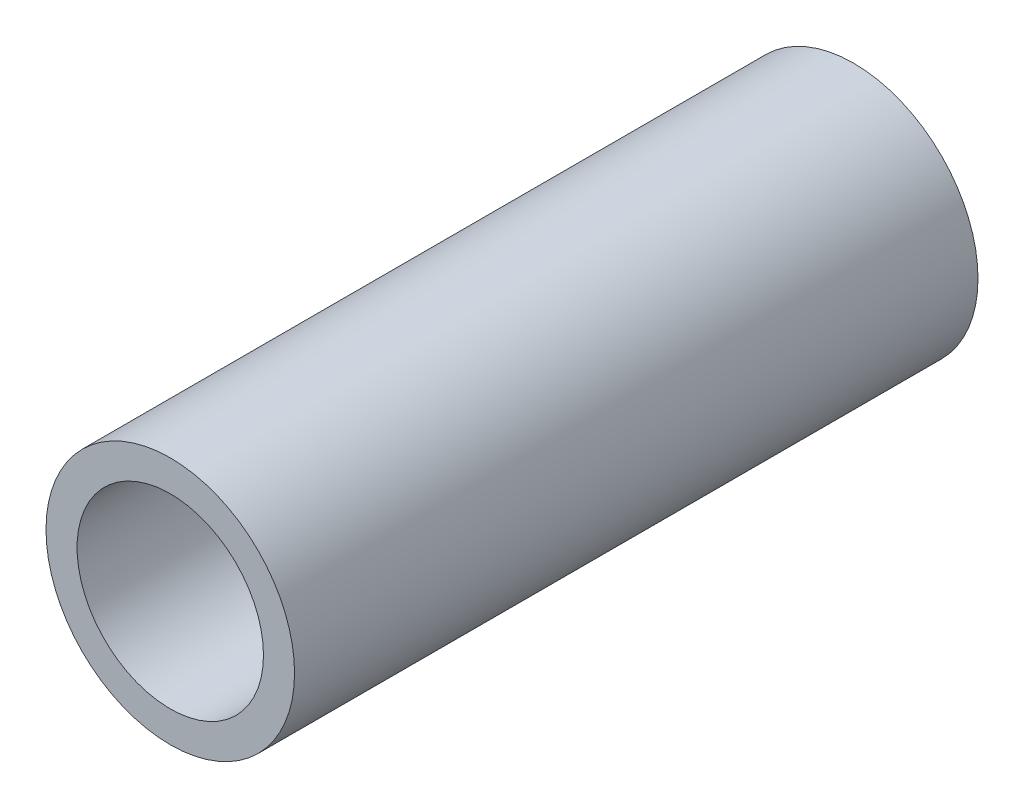
ISO-10303-21;
HEADER;
FILE_DESCRIPTION(('STEP AP214'),'2;1');
FILE_NAME('part.step','',(''),(''),'','','');
FILE_SCHEMA(('AUTOMOTIVE_DESIGN { 1 0 10303 214 1 1 1 1 }'));
ENDSEC;
DATA;
#1=APPLICATION_CONTEXT('core data for automotive mechanical design processes');
#2=APPLICATION_PROTOCOL_DEFINITION('international standard','automotive_design',2000,#1);
#3=PRODUCT_CONTEXT('',#1,'mechanical');
#4=PRODUCT('Part','Part','',(#3));
#5=PRODUCT_RELATED_PRODUCT_CATEGORY('part','',(#4));
#6=PRODUCT_DEFINITION_FORMATION('','',#4);
#7=PRODUCT_DEFINITION_CONTEXT('part definition',#1,'design');
#8=PRODUCT_DEFINITION('design','',#6,#7);
#9=PRODUCT_DEFINITION_SHAPE('','',#8);
#10=(LENGTH_UNIT() NAMED_UNIT(*) SI_UNIT(.MILLI.,.METRE.));
#11=(NAMED_UNIT(*) PLANE_ANGLE_UNIT() SI_UNIT($,.RADIAN.));
#12=(NAMED_UNIT(*) SI_UNIT($,.STERADIAN.) SOLID_ANGLE_UNIT());
#13=UNCERTAINTY_MEASURE_WITH_UNIT(LENGTH_MEASURE(1.E-05),#10,'distance_accuracy_value','');
#14=(GEOMETRIC_REPRESENTATION_CONTEXT(3) GLOBAL_UNCERTAINTY_ASSIGNED_CONTEXT((#13)) GLOBAL_UNIT_ASSIGNED_CONTEXT((#10,
#11,#12)) REPRESENTATION_CONTEXT('',''));
#15=CARTESIAN_POINT('',(0.,0.,0.));
#16=DIRECTION('',(0.,0.,1.));
#17=DIRECTION('',(1.,0.,0.));
#18=AXIS2_PLACEMENT_3D('',#15,#16,#17);
#19=CARTESIAN_POINT('',(0.,0.,22.));
#20=DIRECTION('',(0.,0.,1.));
#21=DIRECTION('',(1.,0.,0.));
#22=AXIS2_PLACEMENT_3D('',#19,#20,#21);
#23=PLANE('',#22);
#24=CARTESIAN_POINT('',(0.,0.,22.));
#25=DIRECTION('',(0.,0.,1.));
#26=DIRECTION('',(1.,0.,0.));
#27=AXIS2_PLACEMENT_3D('',#24,#25,#26);
#28=CIRCLE('',#27,4.);
#29=CARTESIAN_POINT('',(4.,0.,22.));
#30=VERTEX_POINT('',#29);
#31=EDGE_CURVE('E11',#30,#30,#28,.T.);
#32=ORIENTED_EDGE('',*,*,#31,.T.);
#33=EDGE_LOOP('',(#32));
#34=FACE_BOUND('',#33,.T.);
#35=CARTESIAN_POINT('',(0.,0.,22.));
#36=DIRECTION('',(0.,0.,1.));
#37=DIRECTION('',(1.,0.,0.));
#38=AXIS2_PLACEMENT_3D('',#35,#36,#37);
#39=CIRCLE('',#38,3.);
#40=CARTESIAN_POINT('',(3.,0.,22.));
#41=VERTEX_POINT('',#40);
#42=EDGE_CURVE('E50',#41,#41,#39,.T.);
#43=ORIENTED_EDGE('',*,*,#42,.F.);
#44=EDGE_LOOP('',(#43));
#45=FACE_BOUND('',#44,.T.);
#46=ADVANCED_FACE('F39',(#34,#45),#23,.T.);
#47=CARTESIAN_POINT('',(0.,0.,0.));
#48=DIRECTION('',(0.,0.,1.));
#49=DIRECTION('',(1.,0.,0.));
#50=AXIS2_PLACEMENT_3D('',#47,#48,#49);
#51=PLANE('',#50);
#52=CARTESIAN_POINT('',(0.,0.,0.));
#53=DIRECTION('',(0.,0.,1.));
#54=DIRECTION('',(1.,0.,0.));
#55=AXIS2_PLACEMENT_3D('',#52,#53,#54);
#56=CIRCLE('',#55,4.);
#57=CARTESIAN_POINT('',(4.,0.,0.));
#58=VERTEX_POINT('',#57);
#59=EDGE_CURVE('E43',#58,#58,#56,.T.);
#60=ORIENTED_EDGE('',*,*,#59,.F.);
#61=EDGE_LOOP('',(#60));
#62=FACE_BOUND('',#61,.T.);
#63=CARTESIAN_POINT('',(0.,0.,0.));
#64=DIRECTION('',(0.,0.,1.));
#65=DIRECTION('',(1.,0.,0.));
#66=AXIS2_PLACEMENT_3D('',#63,#64,#65);
#67=CIRCLE('',#66,3.);
#68=CARTESIAN_POINT('',(3.,0.,0.));
#69=VERTEX_POINT('',#68);
#70=EDGE_CURVE('E52',#69,#69,#67,.T.);
#71=ORIENTED_EDGE('',*,*,#70,.T.);
#72=EDGE_LOOP('',(#71));
#73=FACE_BOUND('',#72,.T.);
#74=ADVANCED_FACE('F62',(#62,#73),#51,.F.);
#75=CARTESIAN_POINT('',(0.,0.,22.));
#76=DIRECTION('',(0.,0.,-1.));
#77=DIRECTION('',(-1.,0.,0.));
#78=AXIS2_PLACEMENT_3D('',#75,#76,#77);
#79=CYLINDRICAL_SURFACE('',#78,4.);
#80=ORIENTED_EDGE('',*,*,#31,.F.);
#81=EDGE_LOOP('',(#80));
#82=FACE_BOUND('',#81,.T.);
#83=ORIENTED_EDGE('',*,*,#59,.T.);
#84=EDGE_LOOP('',(#83));
#85=FACE_BOUND('',#84,.T.);
#86=ADVANCED_FACE('F41',(#82,#85),#79,.T.);
#87=CARTESIAN_POINT('',(0.,0.,22.));
#88=DIRECTION('',(0.,0.,-1.));
#89=DIRECTION('',(-1.,0.,0.));
#90=AXIS2_PLACEMENT_3D('',#87,#88,#89);
#91=CYLINDRICAL_SURFACE('',#90,3.);
#92=ORIENTED_EDGE('',*,*,#42,.T.);
#93=EDGE_LOOP('',(#92));
#94=FACE_BOUND('',#93,.T.);
#95=ORIENTED_EDGE('',*,*,#70,.F.);
#96=EDGE_LOOP('',(#95));
#97=FACE_BOUND('',#96,.T.);
#98=ADVANCED_FACE('F58',(#94,#97),#91,.F.);
#99=CLOSED_SHELL('',(#46,#74,#86,#98));
#100=MANIFOLD_SOLID_BREP('B2',#99);
#101=ADVANCED_BREP_SHAPE_REPRESENTATION('',(#18,#100),#14);
#102=SHAPE_DEFINITION_REPRESENTATION(#9,#101);
ENDSEC;
END-ISO-10303-21;
